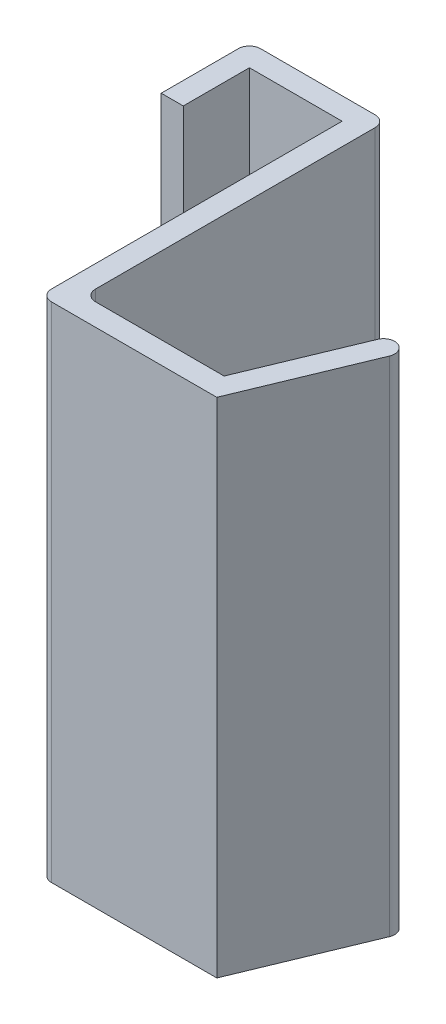
ISO-10303-21;
HEADER;
FILE_DESCRIPTION(('STEP AP214'),'2;1');
FILE_NAME('part.step','',(''),(''),'','','');
FILE_SCHEMA(('AUTOMOTIVE_DESIGN { 1 0 10303 214 1 1 1 1 }'));
ENDSEC;
DATA;
#1=APPLICATION_CONTEXT('core data for automotive mechanical design processes');
#2=APPLICATION_PROTOCOL_DEFINITION('international standard','automotive_design',2000,#1);
#3=PRODUCT_CONTEXT('',#1,'mechanical');
#4=PRODUCT('Part','Part','',(#3));
#5=PRODUCT_RELATED_PRODUCT_CATEGORY('part','',(#4));
#6=PRODUCT_DEFINITION_FORMATION('','',#4);
#7=PRODUCT_DEFINITION_CONTEXT('part definition',#1,'design');
#8=PRODUCT_DEFINITION('design','',#6,#7);
#9=PRODUCT_DEFINITION_SHAPE('','',#8);
#10=(LENGTH_UNIT() NAMED_UNIT(*) SI_UNIT(.MILLI.,.METRE.));
#11=(NAMED_UNIT(*) PLANE_ANGLE_UNIT() SI_UNIT($,.RADIAN.));
#12=(NAMED_UNIT(*) SI_UNIT($,.STERADIAN.) SOLID_ANGLE_UNIT());
#13=UNCERTAINTY_MEASURE_WITH_UNIT(LENGTH_MEASURE(1.E-05),#10,'distance_accuracy_value','');
#14=(GEOMETRIC_REPRESENTATION_CONTEXT(3) GLOBAL_UNCERTAINTY_ASSIGNED_CONTEXT((#13)) GLOBAL_UNIT_ASSIGNED_CONTEXT((#10,
#11,#12)) REPRESENTATION_CONTEXT('',''));
#15=CARTESIAN_POINT('',(0.,0.,0.));
#16=DIRECTION('',(0.,0.,1.));
#17=DIRECTION('',(1.,0.,0.));
#18=AXIS2_PLACEMENT_3D('',#15,#16,#17);
#19=CARTESIAN_POINT('',(0.,114.,-36.7));
#20=DIRECTION('',(0.,0.,1.));
#21=DIRECTION('',(1.,0.,0.));
#22=AXIS2_PLACEMENT_3D('',#19,#20,#21);
#23=PLANE('',#22);
#24=DIRECTION('',(-1.,0.,0.));
#25=VECTOR('',#24,1.);
#26=CARTESIAN_POINT('',(0.,114.,-36.7));
#27=LINE('',#26,#25);
#28=CARTESIAN_POINT('',(2.5,114.,-36.7));
#29=VERTEX_POINT('',#28);
#30=CARTESIAN_POINT('',(-23.5,114.,-36.7));
#31=VERTEX_POINT('',#30);
#32=EDGE_CURVE('E230',#29,#31,#27,.T.);
#33=ORIENTED_EDGE('',*,*,#32,.F.);
#34=DIRECTION('',(0.,-1.,0.));
#35=VECTOR('',#34,1.);
#36=CARTESIAN_POINT('',(2.5,114.,-36.7));
#37=LINE('',#36,#35);
#38=CARTESIAN_POINT('',(2.5,0.,-36.7));
#39=VERTEX_POINT('',#38);
#40=EDGE_CURVE('E313',#29,#39,#37,.T.);
#41=ORIENTED_EDGE('',*,*,#40,.T.);
#42=DIRECTION('',(-1.,0.,0.));
#43=VECTOR('',#42,1.);
#44=CARTESIAN_POINT('',(0.,0.,-36.7));
#45=LINE('',#44,#43);
#46=CARTESIAN_POINT('',(-23.5,0.,-36.7));
#47=VERTEX_POINT('',#46);
#48=EDGE_CURVE('E251',#39,#47,#45,.T.);
#49=ORIENTED_EDGE('',*,*,#48,.T.);
#50=DIRECTION('',(0.,-1.,0.));
#51=VECTOR('',#50,1.);
#52=CARTESIAN_POINT('',(-23.5,114.,-36.7));
#53=LINE('',#52,#51);
#54=EDGE_CURVE('E309',#47,#31,#53,.F.);
#55=ORIENTED_EDGE('',*,*,#54,.T.);
#56=EDGE_LOOP('',(#33,#41,#49,#55));
#57=FACE_BOUND('',#56,.T.);
#58=ADVANCED_FACE('F101',(#57),#23,.F.);
#59=CARTESIAN_POINT('',(-26.,114.,0.));
#60=DIRECTION('',(1.,0.,0.));
#61=DIRECTION('',(0.,0.,-1.));
#62=AXIS2_PLACEMENT_3D('',#59,#60,#61);
#63=PLANE('',#62);
#64=DIRECTION('',(0.,0.,1.));
#65=VECTOR('',#64,1.);
#66=CARTESIAN_POINT('',(-26.,114.,0.));
#67=LINE('',#66,#65);
#68=CARTESIAN_POINT('',(-26.,114.,-34.2));
#69=VERTEX_POINT('',#68);
#70=CARTESIAN_POINT('',(-26.,114.,-16.7));
#71=VERTEX_POINT('',#70);
#72=EDGE_CURVE('E218',#69,#71,#67,.T.);
#73=ORIENTED_EDGE('',*,*,#72,.F.);
#74=DIRECTION('',(0.,-1.,0.));
#75=VECTOR('',#74,1.);
#76=CARTESIAN_POINT('',(-26.,114.,-34.2));
#77=LINE('',#76,#75);
#78=CARTESIAN_POINT('',(-26.,0.,-34.2));
#79=VERTEX_POINT('',#78);
#80=EDGE_CURVE('E304',#69,#79,#77,.T.);
#81=ORIENTED_EDGE('',*,*,#80,.T.);
#82=DIRECTION('',(0.,0.,1.));
#83=VECTOR('',#82,1.);
#84=CARTESIAN_POINT('',(-26.,0.,0.));
#85=LINE('',#84,#83);
#86=CARTESIAN_POINT('',(-26.,0.,-16.7));
#87=VERTEX_POINT('',#86);
#88=EDGE_CURVE('E236',#79,#87,#85,.T.);
#89=ORIENTED_EDGE('',*,*,#88,.T.);
#90=DIRECTION('',(0.,-1.,0.));
#91=VECTOR('',#90,1.);
#92=CARTESIAN_POINT('',(-26.,114.,-16.7));
#93=LINE('',#92,#91);
#94=EDGE_CURVE('E233',#71,#87,#93,.T.);
#95=ORIENTED_EDGE('',*,*,#94,.F.);
#96=EDGE_LOOP('',(#73,#81,#89,#95));
#97=FACE_BOUND('',#96,.T.);
#98=ADVANCED_FACE('F234',(#97),#63,.F.);
#99=CARTESIAN_POINT('',(0.,114.,-16.7));
#100=DIRECTION('',(0.,0.,1.));
#101=DIRECTION('',(1.,0.,0.));
#102=AXIS2_PLACEMENT_3D('',#99,#100,#101);
#103=PLANE('',#102);
#104=DIRECTION('',(-1.,0.,0.));
#105=VECTOR('',#104,1.);
#106=CARTESIAN_POINT('',(0.,0.,-16.7));
#107=LINE('',#106,#105);
#108=CARTESIAN_POINT('',(-21.,0.,-16.7));
#109=VERTEX_POINT('',#108);
#110=EDGE_CURVE('E255',#109,#87,#107,.T.);
#111=ORIENTED_EDGE('',*,*,#110,.F.);
#112=DIRECTION('',(0.,-1.,0.));
#113=VECTOR('',#112,1.);
#114=CARTESIAN_POINT('',(-21.,114.,-16.7));
#115=LINE('',#114,#113);
#116=CARTESIAN_POINT('',(-21.,114.,-16.7));
#117=VERTEX_POINT('',#116);
#118=EDGE_CURVE('E241',#117,#109,#115,.T.);
#119=ORIENTED_EDGE('',*,*,#118,.F.);
#120=DIRECTION('',(-1.,0.,0.));
#121=VECTOR('',#120,1.);
#122=CARTESIAN_POINT('',(0.,114.,-16.7));
#123=LINE('',#122,#121);
#124=EDGE_CURVE('E224',#117,#71,#123,.T.);
#125=ORIENTED_EDGE('',*,*,#124,.T.);
#126=ORIENTED_EDGE('',*,*,#94,.T.);
#127=EDGE_LOOP('',(#111,#119,#125,#126));
#128=FACE_BOUND('',#127,.T.);
#129=ADVANCED_FACE('F244',(#128),#103,.T.);
#130=CARTESIAN_POINT('',(-21.,114.,0.));
#131=DIRECTION('',(1.,0.,0.));
#132=DIRECTION('',(0.,0.,-1.));
#133=AXIS2_PLACEMENT_3D('',#130,#131,#132);
#134=PLANE('',#133);
#135=DIRECTION('',(0.,-1.,0.));
#136=VECTOR('',#135,1.);
#137=CARTESIAN_POINT('',(-21.,114.,-31.7));
#138=LINE('',#137,#136);
#139=CARTESIAN_POINT('',(-21.,114.,-31.7));
#140=VERTEX_POINT('',#139);
#141=CARTESIAN_POINT('',(-21.,0.,-31.7));
#142=VERTEX_POINT('',#141);
#143=EDGE_CURVE('E240',#140,#142,#138,.T.);
#144=ORIENTED_EDGE('',*,*,#143,.F.);
#145=DIRECTION('',(0.,0.,1.));
#146=VECTOR('',#145,1.);
#147=CARTESIAN_POINT('',(-21.,114.,0.));
#148=LINE('',#147,#146);
#149=EDGE_CURVE('E246',#140,#117,#148,.T.);
#150=ORIENTED_EDGE('',*,*,#149,.T.);
#151=ORIENTED_EDGE('',*,*,#118,.T.);
#152=DIRECTION('',(0.,0.,1.));
#153=VECTOR('',#152,1.);
#154=CARTESIAN_POINT('',(-21.,0.,0.));
#155=LINE('',#154,#153);
#156=EDGE_CURVE('E257',#142,#109,#155,.T.);
#157=ORIENTED_EDGE('',*,*,#156,.F.);
#158=EDGE_LOOP('',(#144,#150,#151,#157));
#159=FACE_BOUND('',#158,.T.);
#160=ADVANCED_FACE('F374',(#159),#134,.T.);
#161=CARTESIAN_POINT('',(0.,114.,0.));
#162=DIRECTION('',(0.,1.,0.));
#163=DIRECTION('',(0.,0.,1.));
#164=AXIS2_PLACEMENT_3D('',#161,#162,#163);
#165=PLANE('',#164);
#166=DIRECTION('',(0.,0.,1.));
#167=VECTOR('',#166,1.);
#168=CARTESIAN_POINT('',(0.,114.,0.));
#169=LINE('',#168,#167);
#170=CARTESIAN_POINT('',(0.,114.,-31.7));
#171=VERTEX_POINT('',#170);
#172=CARTESIAN_POINT('',(0.,114.,34.2));
#173=VERTEX_POINT('',#172);
#174=EDGE_CURVE('E268',#171,#173,#169,.T.);
#175=ORIENTED_EDGE('',*,*,#174,.T.);
#176=CARTESIAN_POINT('',(2.5,114.,34.2));
#177=DIRECTION('',(0.,1.,0.));
#178=DIRECTION('',(0.,0.,1.));
#179=AXIS2_PLACEMENT_3D('',#176,#177,#178);
#180=CIRCLE('',#179,2.5);
#181=CARTESIAN_POINT('',(2.5,114.,36.7));
#182=VERTEX_POINT('',#181);
#183=EDGE_CURVE('E346',#173,#182,#180,.T.);
#184=ORIENTED_EDGE('',*,*,#183,.T.);
#185=DIRECTION('',(1.,0.,0.));
#186=VECTOR('',#185,1.);
#187=CARTESIAN_POINT('',(0.,114.,36.7));
#188=LINE('',#187,#186);
#189=CARTESIAN_POINT('',(40.,114.,36.7));
#190=VERTEX_POINT('',#189);
#191=EDGE_CURVE('E270',#182,#190,#188,.T.);
#192=ORIENTED_EDGE('',*,*,#191,.T.);
#193=DIRECTION('',(0.382683432365087,0.,-0.923879532511288));
#194=VECTOR('',#193,1.);
#195=CARTESIAN_POINT('',(47.1175450585041,114.,19.5167261889576));
#196=LINE('',#195,#194);
#197=CARTESIAN_POINT('',(51.46969829028,114.,9.00969883127822));
#198=VERTEX_POINT('',#197);
#199=EDGE_CURVE('E272',#190,#198,#196,.T.);
#200=ORIENTED_EDGE('',*,*,#199,.T.);
#201=CARTESIAN_POINT('',(49.1599994590018,114.,8.05299025036551));
#202=DIRECTION('',(0.,1.,0.));
#203=DIRECTION('',(0.,0.,1.));
#204=AXIS2_PLACEMENT_3D('',#201,#202,#203);
#205=CIRCLE('',#204,2.5);
#206=CARTESIAN_POINT('',(50.1167080399145,114.,5.74329141908728));
#207=VERTEX_POINT('',#206);
#208=EDGE_CURVE('E333',#198,#207,#205,.T.);
#209=ORIENTED_EDGE('',*,*,#208,.T.);
#210=CARTESIAN_POINT('',(49.1599994590018,114.,8.0529902503655));
#211=DIRECTION('',(0.,1.,0.));
#212=DIRECTION('',(0.,0.,1.));
#213=AXIS2_PLACEMENT_3D('',#210,#211,#212);
#214=CIRCLE('',#213,2.5);
#215=CARTESIAN_POINT('',(46.8503006277236,114.,7.09628166945279));
#216=VERTEX_POINT('',#215);
#217=EDGE_CURVE('E331',#207,#216,#214,.T.);
#218=ORIENTED_EDGE('',*,*,#217,.T.);
#219=DIRECTION('',(0.382683432365087,0.,-0.923879532511288));
#220=VECTOR('',#219,1.);
#221=CARTESIAN_POINT('',(42.4981473959477,114.,17.6033090271322));
#222=LINE('',#221,#220);
#223=CARTESIAN_POINT('',(36.6591068104035,114.,31.7));
#224=VERTEX_POINT('',#223);
#225=EDGE_CURVE('E260',#224,#216,#222,.T.);
#226=ORIENTED_EDGE('',*,*,#225,.F.);
#227=DIRECTION('',(1.,0.,0.));
#228=VECTOR('',#227,1.);
#229=CARTESIAN_POINT('',(0.,114.,31.7));
#230=LINE('',#229,#228);
#231=CARTESIAN_POINT('',(7.5,114.,31.7));
#232=VERTEX_POINT('',#231);
#233=EDGE_CURVE('E263',#232,#224,#230,.T.);
#234=ORIENTED_EDGE('',*,*,#233,.F.);
#235=CARTESIAN_POINT('',(7.5,114.,29.2));
#236=DIRECTION('',(0.,1.,0.));
#237=DIRECTION('',(0.,0.,1.));
#238=AXIS2_PLACEMENT_3D('',#235,#236,#237);
#239=CIRCLE('',#238,2.5);
#240=CARTESIAN_POINT('',(5.,114.,29.2));
#241=VERTEX_POINT('',#240);
#242=EDGE_CURVE('E12',#232,#241,#239,.F.);
#243=ORIENTED_EDGE('',*,*,#242,.T.);
#244=DIRECTION('',(0.,0.,-1.));
#245=VECTOR('',#244,1.);
#246=CARTESIAN_POINT('',(5.,114.,0.));
#247=LINE('',#246,#245);
#248=CARTESIAN_POINT('',(5.,114.,-34.2));
#249=VERTEX_POINT('',#248);
#250=EDGE_CURVE('E266',#241,#249,#247,.T.);
#251=ORIENTED_EDGE('',*,*,#250,.T.);
#252=CARTESIAN_POINT('',(2.5,114.,-34.2));
#253=DIRECTION('',(0.,1.,0.));
#254=DIRECTION('',(0.,0.,1.));
#255=AXIS2_PLACEMENT_3D('',#252,#253,#254);
#256=CIRCLE('',#255,2.5);
#257=EDGE_CURVE('E322',#249,#29,#256,.T.);
#258=ORIENTED_EDGE('',*,*,#257,.T.);
#259=ORIENTED_EDGE('',*,*,#32,.T.);
#260=CARTESIAN_POINT('',(-23.5,114.,-34.2));
#261=DIRECTION('',(0.,1.,0.));
#262=DIRECTION('',(0.,0.,1.));
#263=AXIS2_PLACEMENT_3D('',#260,#261,#262);
#264=CIRCLE('',#263,2.5);
#265=EDGE_CURVE('E226',#31,#69,#264,.T.);
#266=ORIENTED_EDGE('',*,*,#265,.T.);
#267=ORIENTED_EDGE('',*,*,#72,.T.);
#268=ORIENTED_EDGE('',*,*,#124,.F.);
#269=ORIENTED_EDGE('',*,*,#149,.F.);
#270=DIRECTION('',(-1.,0.,0.));
#271=VECTOR('',#270,1.);
#272=CARTESIAN_POINT('',(0.,114.,-31.7));
#273=LINE('',#272,#271);
#274=EDGE_CURVE('E280',#171,#140,#273,.T.);
#275=ORIENTED_EDGE('',*,*,#274,.F.);
#276=EDGE_LOOP('',(#175,#184,#192,#200,#209,#218,#226,#234,#243,#251,#258,#259,#266,#267,#268,
#269,#275));
#277=FACE_BOUND('',#276,.T.);
#278=ADVANCED_FACE('F221',(#277),#165,.T.);
#279=CARTESIAN_POINT('',(0.,0.,0.));
#280=DIRECTION('',(0.,1.,0.));
#281=DIRECTION('',(0.,0.,1.));
#282=AXIS2_PLACEMENT_3D('',#279,#280,#281);
#283=PLANE('',#282);
#284=DIRECTION('',(1.,0.,0.));
#285=VECTOR('',#284,1.);
#286=CARTESIAN_POINT('',(0.,0.,36.7));
#287=LINE('',#286,#285);
#288=CARTESIAN_POINT('',(2.5,0.,36.7));
#289=VERTEX_POINT('',#288);
#290=CARTESIAN_POINT('',(40.,0.,36.7));
#291=VERTEX_POINT('',#290);
#292=EDGE_CURVE('E287',#289,#291,#287,.T.);
#293=ORIENTED_EDGE('',*,*,#292,.F.);
#294=CARTESIAN_POINT('',(2.5,0.,34.2));
#295=DIRECTION('',(0.,1.,0.));
#296=DIRECTION('',(0.,0.,1.));
#297=AXIS2_PLACEMENT_3D('',#294,#295,#296);
#298=CIRCLE('',#297,2.5);
#299=CARTESIAN_POINT('',(0.,0.,34.2));
#300=VERTEX_POINT('',#299);
#301=EDGE_CURVE('E342',#289,#300,#298,.F.);
#302=ORIENTED_EDGE('',*,*,#301,.T.);
#303=DIRECTION('',(0.,0.,1.));
#304=VECTOR('',#303,1.);
#305=CARTESIAN_POINT('',(0.,0.,0.));
#306=LINE('',#305,#304);
#307=CARTESIAN_POINT('',(0.,0.,-31.7));
#308=VERTEX_POINT('',#307);
#309=EDGE_CURVE('E284',#308,#300,#306,.T.);
#310=ORIENTED_EDGE('',*,*,#309,.F.);
#311=DIRECTION('',(-1.,0.,0.));
#312=VECTOR('',#311,1.);
#313=CARTESIAN_POINT('',(0.,0.,-31.7));
#314=LINE('',#313,#312);
#315=EDGE_CURVE('E298',#308,#142,#314,.T.);
#316=ORIENTED_EDGE('',*,*,#315,.T.);
#317=ORIENTED_EDGE('',*,*,#156,.T.);
#318=ORIENTED_EDGE('',*,*,#110,.T.);
#319=ORIENTED_EDGE('',*,*,#88,.F.);
#320=CARTESIAN_POINT('',(-23.5,0.,-34.2));
#321=DIRECTION('',(0.,1.,0.));
#322=DIRECTION('',(0.,0.,1.));
#323=AXIS2_PLACEMENT_3D('',#320,#321,#322);
#324=CIRCLE('',#323,2.5);
#325=EDGE_CURVE('E306',#79,#47,#324,.F.);
#326=ORIENTED_EDGE('',*,*,#325,.T.);
#327=ORIENTED_EDGE('',*,*,#48,.F.);
#328=CARTESIAN_POINT('',(2.5,0.,-34.2));
#329=DIRECTION('',(0.,1.,0.));
#330=DIRECTION('',(0.,0.,1.));
#331=AXIS2_PLACEMENT_3D('',#328,#329,#330);
#332=CIRCLE('',#331,2.5);
#333=CARTESIAN_POINT('',(5.,0.,-34.2));
#334=VERTEX_POINT('',#333);
#335=EDGE_CURVE('E316',#39,#334,#332,.F.);
#336=ORIENTED_EDGE('',*,*,#335,.T.);
#337=DIRECTION('',(0.,0.,-1.));
#338=VECTOR('',#337,1.);
#339=CARTESIAN_POINT('',(5.,0.,0.));
#340=LINE('',#339,#338);
#341=CARTESIAN_POINT('',(5.,0.,29.2));
#342=VERTEX_POINT('',#341);
#343=EDGE_CURVE('E282',#342,#334,#340,.T.);
#344=ORIENTED_EDGE('',*,*,#343,.F.);
#345=CARTESIAN_POINT('',(7.5,0.,29.2));
#346=DIRECTION('',(0.,1.,0.));
#347=DIRECTION('',(0.,0.,1.));
#348=AXIS2_PLACEMENT_3D('',#345,#346,#347);
#349=CIRCLE('',#348,2.5);
#350=CARTESIAN_POINT('',(7.5,0.,31.7));
#351=VERTEX_POINT('',#350);
#352=EDGE_CURVE('E109',#342,#351,#349,.T.);
#353=ORIENTED_EDGE('',*,*,#352,.T.);
#354=DIRECTION('',(1.,0.,0.));
#355=VECTOR('',#354,1.);
#356=CARTESIAN_POINT('',(0.,0.,31.7));
#357=LINE('',#356,#355);
#358=CARTESIAN_POINT('',(36.6591068104035,0.,31.7));
#359=VERTEX_POINT('',#358);
#360=EDGE_CURVE('E279',#351,#359,#357,.T.);
#361=ORIENTED_EDGE('',*,*,#360,.T.);
#362=DIRECTION('',(0.382683432365087,0.,-0.923879532511288));
#363=VECTOR('',#362,1.);
#364=CARTESIAN_POINT('',(42.4981473959477,0.,17.6033090271322));
#365=LINE('',#364,#363);
#366=CARTESIAN_POINT('',(46.8503006277236,0.,7.09628166945279));
#367=VERTEX_POINT('',#366);
#368=EDGE_CURVE('E276',#359,#367,#365,.T.);
#369=ORIENTED_EDGE('',*,*,#368,.T.);
#370=CARTESIAN_POINT('',(49.1599994590018,0.,8.0529902503655));
#371=DIRECTION('',(0.,1.,0.));
#372=DIRECTION('',(0.,0.,1.));
#373=AXIS2_PLACEMENT_3D('',#370,#371,#372);
#374=CIRCLE('',#373,2.5);
#375=CARTESIAN_POINT('',(50.1167080399145,0.,5.74329141908728));
#376=VERTEX_POINT('',#375);
#377=EDGE_CURVE('E324',#367,#376,#374,.F.);
#378=ORIENTED_EDGE('',*,*,#377,.T.);
#379=CARTESIAN_POINT('',(49.1599994590018,0.,8.05299025036551));
#380=DIRECTION('',(0.,1.,0.));
#381=DIRECTION('',(0.,0.,1.));
#382=AXIS2_PLACEMENT_3D('',#379,#380,#381);
#383=CIRCLE('',#382,2.5);
#384=CARTESIAN_POINT('',(51.46969829028,0.,9.00969883127822));
#385=VERTEX_POINT('',#384);
#386=EDGE_CURVE('E326',#376,#385,#383,.F.);
#387=ORIENTED_EDGE('',*,*,#386,.T.);
#388=DIRECTION('',(0.382683432365087,0.,-0.923879532511288));
#389=VECTOR('',#388,1.);
#390=CARTESIAN_POINT('',(47.1175450585041,0.,19.5167261889576));
#391=LINE('',#390,#389);
#392=EDGE_CURVE('E264',#291,#385,#391,.T.);
#393=ORIENTED_EDGE('',*,*,#392,.F.);
#394=EDGE_LOOP('',(#293,#302,#310,#316,#317,#318,#319,#326,#327,#336,#344,#353,#361,#369,#378,
#387,#393));
#395=FACE_BOUND('',#394,.T.);
#396=ADVANCED_FACE('F358',(#395),#283,.F.);
#397=CARTESIAN_POINT('',(47.1175450585041,114.,19.5167261889576));
#398=DIRECTION('',(-0.923879532511288,0.,-0.382683432365087));
#399=DIRECTION('',(-0.382683432365087,0.,0.923879532511288));
#400=AXIS2_PLACEMENT_3D('',#397,#398,#399);
#401=PLANE('',#400);
#402=ORIENTED_EDGE('',*,*,#392,.T.);
#403=DIRECTION('',(0.,-1.,0.));
#404=VECTOR('',#403,1.);
#405=CARTESIAN_POINT('',(51.46969829028,114.,9.00969883127822));
#406=LINE('',#405,#404);
#407=EDGE_CURVE('E328',#385,#198,#406,.F.);
#408=ORIENTED_EDGE('',*,*,#407,.T.);
#409=ORIENTED_EDGE('',*,*,#199,.F.);
#410=DIRECTION('',(0.,-1.,0.));
#411=VECTOR('',#410,1.);
#412=CARTESIAN_POINT('',(40.,114.,36.7));
#413=LINE('',#412,#411);
#414=EDGE_CURVE('E275',#190,#291,#413,.T.);
#415=ORIENTED_EDGE('',*,*,#414,.T.);
#416=EDGE_LOOP('',(#402,#408,#409,#415));
#417=FACE_BOUND('',#416,.T.);
#418=ADVANCED_FACE('F392',(#417),#401,.F.);
#419=CARTESIAN_POINT('',(5.,114.,0.));
#420=DIRECTION('',(-1.,0.,0.));
#421=DIRECTION('',(0.,0.,1.));
#422=AXIS2_PLACEMENT_3D('',#419,#420,#421);
#423=PLANE('',#422);
#424=ORIENTED_EDGE('',*,*,#250,.F.);
#425=DIRECTION('',(0.,-1.,0.));
#426=VECTOR('',#425,1.);
#427=CARTESIAN_POINT('',(5.,114.,29.2));
#428=LINE('',#427,#426);
#429=EDGE_CURVE('E348',#241,#342,#428,.T.);
#430=ORIENTED_EDGE('',*,*,#429,.T.);
#431=ORIENTED_EDGE('',*,*,#343,.T.);
#432=DIRECTION('',(0.,-1.,0.));
#433=VECTOR('',#432,1.);
#434=CARTESIAN_POINT('',(5.,114.,-34.2));
#435=LINE('',#434,#433);
#436=EDGE_CURVE('E319',#334,#249,#435,.F.);
#437=ORIENTED_EDGE('',*,*,#436,.T.);
#438=EDGE_LOOP('',(#424,#430,#431,#437));
#439=FACE_BOUND('',#438,.T.);
#440=ADVANCED_FACE('F354',(#439),#423,.F.);
#441=CARTESIAN_POINT('',(0.,114.,31.7));
#442=DIRECTION('',(0.,0.,-1.));
#443=DIRECTION('',(-1.,0.,0.));
#444=AXIS2_PLACEMENT_3D('',#441,#442,#443);
#445=PLANE('',#444);
#446=ORIENTED_EDGE('',*,*,#360,.F.);
#447=DIRECTION('',(0.,-1.,0.));
#448=VECTOR('',#447,1.);
#449=CARTESIAN_POINT('',(7.5,114.,31.7));
#450=LINE('',#449,#448);
#451=EDGE_CURVE('E116',#351,#232,#450,.F.);
#452=ORIENTED_EDGE('',*,*,#451,.T.);
#453=ORIENTED_EDGE('',*,*,#233,.T.);
#454=DIRECTION('',(0.,-1.,0.));
#455=VECTOR('',#454,1.);
#456=CARTESIAN_POINT('',(36.6591068104035,114.,31.7));
#457=LINE('',#456,#455);
#458=EDGE_CURVE('E293',#224,#359,#457,.T.);
#459=ORIENTED_EDGE('',*,*,#458,.T.);
#460=EDGE_LOOP('',(#446,#452,#453,#459));
#461=FACE_BOUND('',#460,.T.);
#462=ADVANCED_FACE('F415',(#461),#445,.T.);
#463=CARTESIAN_POINT('',(42.4981473959477,114.,17.6033090271322));
#464=DIRECTION('',(-0.923879532511288,0.,-0.382683432365087));
#465=DIRECTION('',(-0.382683432365087,0.,0.923879532511288));
#466=AXIS2_PLACEMENT_3D('',#463,#464,#465);
#467=PLANE('',#466);
#468=ORIENTED_EDGE('',*,*,#225,.T.);
#469=DIRECTION('',(0.,-1.,0.));
#470=VECTOR('',#469,1.);
#471=CARTESIAN_POINT('',(46.8503006277236,0.,7.09628166945279));
#472=LINE('',#471,#470);
#473=EDGE_CURVE('E335',#216,#367,#472,.T.);
#474=ORIENTED_EDGE('',*,*,#473,.T.);
#475=ORIENTED_EDGE('',*,*,#368,.F.);
#476=ORIENTED_EDGE('',*,*,#458,.F.);
#477=EDGE_LOOP('',(#468,#474,#475,#476));
#478=FACE_BOUND('',#477,.T.);
#479=ADVANCED_FACE('F407',(#478),#467,.T.);
#480=CARTESIAN_POINT('',(0.,114.,36.7));
#481=DIRECTION('',(0.,0.,-1.));
#482=DIRECTION('',(-1.,0.,0.));
#483=AXIS2_PLACEMENT_3D('',#480,#481,#482);
#484=PLANE('',#483);
#485=ORIENTED_EDGE('',*,*,#191,.F.);
#486=DIRECTION('',(0.,-1.,0.));
#487=VECTOR('',#486,1.);
#488=CARTESIAN_POINT('',(2.5,114.,36.7));
#489=LINE('',#488,#487);
#490=EDGE_CURVE('E337',#182,#289,#489,.T.);
#491=ORIENTED_EDGE('',*,*,#490,.T.);
#492=ORIENTED_EDGE('',*,*,#292,.T.);
#493=ORIENTED_EDGE('',*,*,#414,.F.);
#494=EDGE_LOOP('',(#485,#491,#492,#493));
#495=FACE_BOUND('',#494,.T.);
#496=ADVANCED_FACE('F388',(#495),#484,.F.);
#497=CARTESIAN_POINT('',(0.,114.,0.));
#498=DIRECTION('',(1.,0.,0.));
#499=DIRECTION('',(0.,0.,-1.));
#500=AXIS2_PLACEMENT_3D('',#497,#498,#499);
#501=PLANE('',#500);
#502=ORIENTED_EDGE('',*,*,#309,.T.);
#503=DIRECTION('',(0.,-1.,0.));
#504=VECTOR('',#503,1.);
#505=CARTESIAN_POINT('',(0.,114.,34.2));
#506=LINE('',#505,#504);
#507=EDGE_CURVE('E344',#300,#173,#506,.F.);
#508=ORIENTED_EDGE('',*,*,#507,.T.);
#509=ORIENTED_EDGE('',*,*,#174,.F.);
#510=DIRECTION('',(0.,-1.,0.));
#511=VECTOR('',#510,1.);
#512=CARTESIAN_POINT('',(0.,114.,-31.7));
#513=LINE('',#512,#511);
#514=EDGE_CURVE('E253',#171,#308,#513,.T.);
#515=ORIENTED_EDGE('',*,*,#514,.T.);
#516=EDGE_LOOP('',(#502,#508,#509,#515));
#517=FACE_BOUND('',#516,.T.);
#518=ADVANCED_FACE('F380',(#517),#501,.F.);
#519=CARTESIAN_POINT('',(0.,114.,-31.7));
#520=DIRECTION('',(0.,0.,1.));
#521=DIRECTION('',(1.,0.,0.));
#522=AXIS2_PLACEMENT_3D('',#519,#520,#521);
#523=PLANE('',#522);
#524=ORIENTED_EDGE('',*,*,#315,.F.);
#525=ORIENTED_EDGE('',*,*,#514,.F.);
#526=ORIENTED_EDGE('',*,*,#274,.T.);
#527=ORIENTED_EDGE('',*,*,#143,.T.);
#528=EDGE_LOOP('',(#524,#525,#526,#527));
#529=FACE_BOUND('',#528,.T.);
#530=ADVANCED_FACE('F432',(#529),#523,.T.);
#531=CARTESIAN_POINT('',(-23.5,114.,-34.2));
#532=DIRECTION('',(0.,-1.,0.));
#533=DIRECTION('',(0.,0.,-1.));
#534=AXIS2_PLACEMENT_3D('',#531,#532,#533);
#535=CYLINDRICAL_SURFACE('',#534,2.5);
#536=ORIENTED_EDGE('',*,*,#265,.F.);
#537=ORIENTED_EDGE('',*,*,#54,.F.);
#538=ORIENTED_EDGE('',*,*,#325,.F.);
#539=ORIENTED_EDGE('',*,*,#80,.F.);
#540=EDGE_LOOP('',(#536,#537,#538,#539));
#541=FACE_BOUND('',#540,.T.);
#542=ADVANCED_FACE('F369',(#541),#535,.T.);
#543=CARTESIAN_POINT('',(2.5,114.,-34.2));
#544=DIRECTION('',(0.,-1.,0.));
#545=DIRECTION('',(0.,0.,-1.));
#546=AXIS2_PLACEMENT_3D('',#543,#544,#545);
#547=CYLINDRICAL_SURFACE('',#546,2.5);
#548=ORIENTED_EDGE('',*,*,#257,.F.);
#549=ORIENTED_EDGE('',*,*,#436,.F.);
#550=ORIENTED_EDGE('',*,*,#335,.F.);
#551=ORIENTED_EDGE('',*,*,#40,.F.);
#552=EDGE_LOOP('',(#548,#549,#550,#551));
#553=FACE_BOUND('',#552,.T.);
#554=ADVANCED_FACE('F364',(#553),#547,.T.);
#555=CARTESIAN_POINT('',(49.1599994590018,114.,8.0529902503655));
#556=DIRECTION('',(0.,1.,0.));
#557=DIRECTION('',(0.,0.,1.));
#558=AXIS2_PLACEMENT_3D('',#555,#556,#557);
#559=CYLINDRICAL_SURFACE('',#558,2.5);
#560=ORIENTED_EDGE('',*,*,#473,.F.);
#561=ORIENTED_EDGE('',*,*,#217,.F.);
#562=DIRECTION('',(0.,-1.,0.));
#563=VECTOR('',#562,1.);
#564=CARTESIAN_POINT('',(50.1167080399145,114.,5.74329141908729));
#565=LINE('',#564,#563);
#566=EDGE_CURVE('E301',#376,#207,#565,.F.);
#567=ORIENTED_EDGE('',*,*,#566,.F.);
#568=ORIENTED_EDGE('',*,*,#377,.F.);
#569=EDGE_LOOP('',(#560,#561,#567,#568));
#570=FACE_BOUND('',#569,.T.);
#571=ADVANCED_FACE('F400',(#570),#559,.T.);
#572=CARTESIAN_POINT('',(49.1599994590018,114.,8.05299025036551));
#573=DIRECTION('',(0.,-1.,0.));
#574=DIRECTION('',(0.,0.,-1.));
#575=AXIS2_PLACEMENT_3D('',#572,#573,#574);
#576=CYLINDRICAL_SURFACE('',#575,2.5);
#577=ORIENTED_EDGE('',*,*,#208,.F.);
#578=ORIENTED_EDGE('',*,*,#407,.F.);
#579=ORIENTED_EDGE('',*,*,#386,.F.);
#580=ORIENTED_EDGE('',*,*,#566,.T.);
#581=EDGE_LOOP('',(#577,#578,#579,#580));
#582=FACE_BOUND('',#581,.T.);
#583=ADVANCED_FACE('F403',(#582),#576,.T.);
#584=CARTESIAN_POINT('',(2.5,114.,34.2));
#585=DIRECTION('',(0.,-1.,0.));
#586=DIRECTION('',(0.,0.,-1.));
#587=AXIS2_PLACEMENT_3D('',#584,#585,#586);
#588=CYLINDRICAL_SURFACE('',#587,2.5);
#589=ORIENTED_EDGE('',*,*,#183,.F.);
#590=ORIENTED_EDGE('',*,*,#507,.F.);
#591=ORIENTED_EDGE('',*,*,#301,.F.);
#592=ORIENTED_EDGE('',*,*,#490,.F.);
#593=EDGE_LOOP('',(#589,#590,#591,#592));
#594=FACE_BOUND('',#593,.T.);
#595=ADVANCED_FACE('F383',(#594),#588,.T.);
#596=CARTESIAN_POINT('',(7.5,114.,29.2));
#597=DIRECTION('',(0.,-1.,0.));
#598=DIRECTION('',(0.,0.,-1.));
#599=AXIS2_PLACEMENT_3D('',#596,#597,#598);
#600=CYLINDRICAL_SURFACE('',#599,2.5);
#601=ORIENTED_EDGE('',*,*,#242,.F.);
#602=ORIENTED_EDGE('',*,*,#451,.F.);
#603=ORIENTED_EDGE('',*,*,#352,.F.);
#604=ORIENTED_EDGE('',*,*,#429,.F.);
#605=EDGE_LOOP('',(#601,#602,#603,#604));
#606=FACE_BOUND('',#605,.T.);
#607=ADVANCED_FACE('F103',(#606),#600,.F.);
#608=CLOSED_SHELL('',(#58,#98,#129,#160,#278,#396,#418,#440,#462,#479,#496,#518,#530,#542,#554,
#571,#583,#595,#607));
#609=MANIFOLD_SOLID_BREP('B2',#608);
#610=ADVANCED_BREP_SHAPE_REPRESENTATION('',(#18,#609),#14);
#611=SHAPE_DEFINITION_REPRESENTATION(#9,#610);
ENDSEC;
END-ISO-10303-21;
